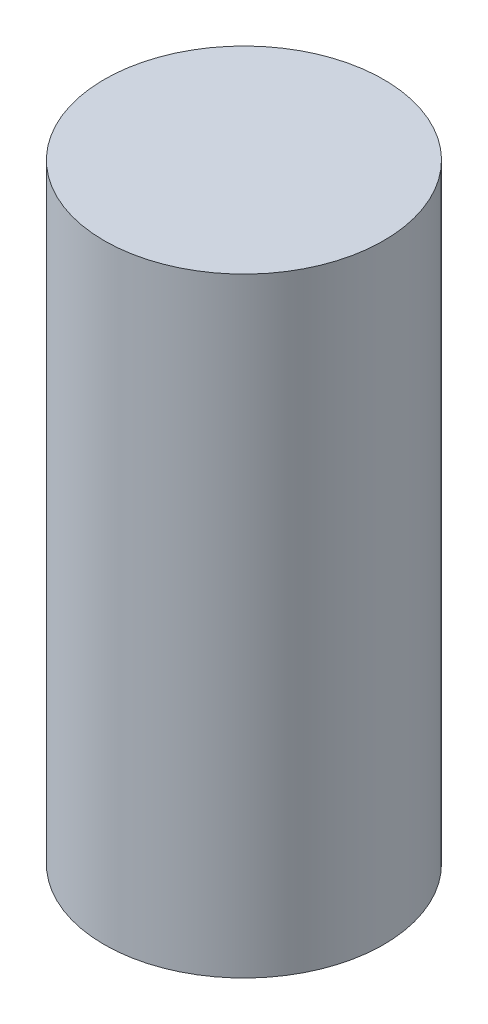
ISO-10303-21;
HEADER;
FILE_DESCRIPTION(('STEP AP214'),'2;1');
FILE_NAME('part.step','',(''),(''),'','','');
FILE_SCHEMA(('AUTOMOTIVE_DESIGN { 1 0 10303 214 1 1 1 1 }'));
ENDSEC;
DATA;
#1=APPLICATION_CONTEXT('core data for automotive mechanical design processes');
#2=APPLICATION_PROTOCOL_DEFINITION('international standard','automotive_design',2000,#1);
#3=PRODUCT_CONTEXT('',#1,'mechanical');
#4=PRODUCT('Part','Part','',(#3));
#5=PRODUCT_RELATED_PRODUCT_CATEGORY('part','',(#4));
#6=PRODUCT_DEFINITION_FORMATION('','',#4);
#7=PRODUCT_DEFINITION_CONTEXT('part definition',#1,'design');
#8=PRODUCT_DEFINITION('design','',#6,#7);
#9=PRODUCT_DEFINITION_SHAPE('','',#8);
#10=(LENGTH_UNIT() NAMED_UNIT(*) SI_UNIT(.MILLI.,.METRE.));
#11=(NAMED_UNIT(*) PLANE_ANGLE_UNIT() SI_UNIT($,.RADIAN.));
#12=(NAMED_UNIT(*) SI_UNIT($,.STERADIAN.) SOLID_ANGLE_UNIT());
#13=UNCERTAINTY_MEASURE_WITH_UNIT(LENGTH_MEASURE(1.E-05),#10,'distance_accuracy_value','');
#14=(GEOMETRIC_REPRESENTATION_CONTEXT(3) GLOBAL_UNCERTAINTY_ASSIGNED_CONTEXT((#13)) GLOBAL_UNIT_ASSIGNED_CONTEXT((#10,
#11,#12)) REPRESENTATION_CONTEXT('',''));
#15=CARTESIAN_POINT('',(0.,0.,0.));
#16=DIRECTION('',(0.,0.,1.));
#17=DIRECTION('',(1.,0.,0.));
#18=AXIS2_PLACEMENT_3D('',#15,#16,#17);
#19=CARTESIAN_POINT('',(0.,24.,0.));
#20=DIRECTION('',(0.,-1.,0.));
#21=DIRECTION('',(0.,0.,-1.));
#22=AXIS2_PLACEMENT_3D('',#19,#20,#21);
#23=CYLINDRICAL_SURFACE('',#22,5.5);
#24=CARTESIAN_POINT('',(0.,24.,0.));
#25=DIRECTION('',(0.,1.,0.));
#26=DIRECTION('',(0.,0.,1.));
#27=AXIS2_PLACEMENT_3D('',#24,#25,#26);
#28=CIRCLE('',#27,5.5);
#29=CARTESIAN_POINT('',(0.,24.,5.5));
#30=VERTEX_POINT('',#29);
#31=EDGE_CURVE('E10',#30,#30,#28,.T.);
#32=ORIENTED_EDGE('',*,*,#31,.F.);
#33=EDGE_LOOP('',(#32));
#34=FACE_BOUND('',#33,.T.);
#35=CARTESIAN_POINT('',(0.,0.,0.));
#36=DIRECTION('',(0.,1.,0.));
#37=DIRECTION('',(0.,0.,1.));
#38=AXIS2_PLACEMENT_3D('',#35,#36,#37);
#39=CIRCLE('',#38,5.5);
#40=CARTESIAN_POINT('',(0.,0.,5.5));
#41=VERTEX_POINT('',#40);
#42=EDGE_CURVE('E36',#41,#41,#39,.T.);
#43=ORIENTED_EDGE('',*,*,#42,.T.);
#44=EDGE_LOOP('',(#43));
#45=FACE_BOUND('',#44,.T.);
#46=ADVANCED_FACE('F33',(#34,#45),#23,.T.);
#47=CARTESIAN_POINT('',(0.,24.,0.));
#48=DIRECTION('',(0.,1.,0.));
#49=DIRECTION('',(0.,0.,1.));
#50=AXIS2_PLACEMENT_3D('',#47,#48,#49);
#51=PLANE('',#50);
#52=ORIENTED_EDGE('',*,*,#31,.T.);
#53=EDGE_LOOP('',(#52));
#54=FACE_BOUND('',#53,.T.);
#55=ADVANCED_FACE('F48',(#54),#51,.T.);
#56=CARTESIAN_POINT('',(0.,0.,0.));
#57=DIRECTION('',(0.,1.,0.));
#58=DIRECTION('',(0.,0.,1.));
#59=AXIS2_PLACEMENT_3D('',#56,#57,#58);
#60=PLANE('',#59);
#61=ORIENTED_EDGE('',*,*,#42,.F.);
#62=EDGE_LOOP('',(#61));
#63=FACE_BOUND('',#62,.T.);
#64=ADVANCED_FACE('F46',(#63),#60,.F.);
#65=CLOSED_SHELL('',(#46,#55,#64));
#66=MANIFOLD_SOLID_BREP('B2',#65);
#67=ADVANCED_BREP_SHAPE_REPRESENTATION('',(#18,#66),#14);
#68=SHAPE_DEFINITION_REPRESENTATION(#9,#67);
ENDSEC;
END-ISO-10303-21;
